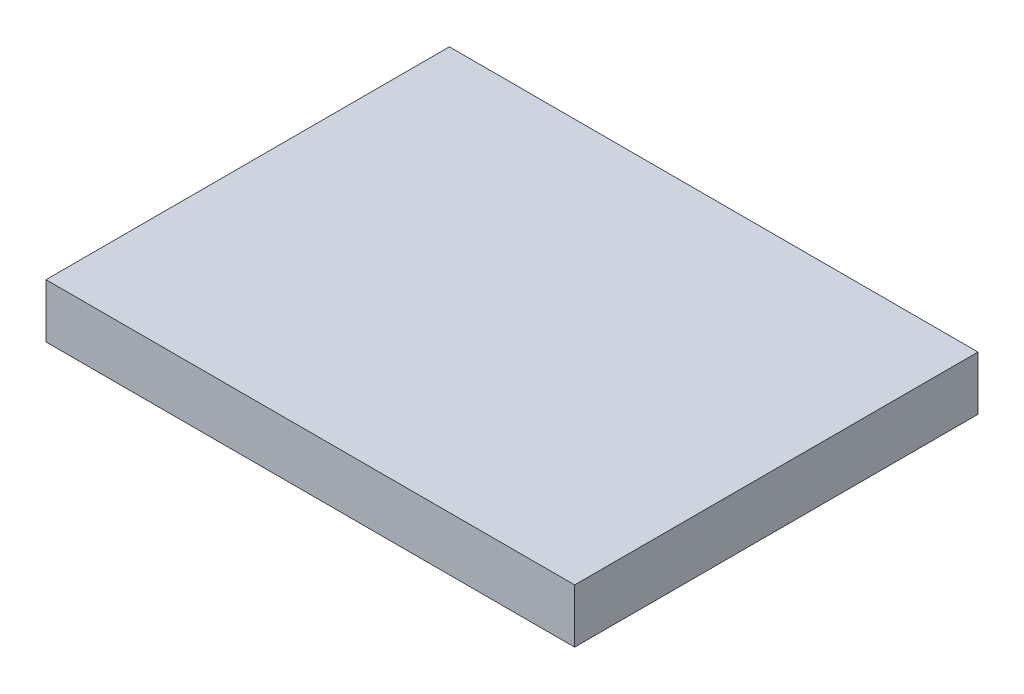
ISO-10303-21;
HEADER;
FILE_DESCRIPTION(('STEP AP214'),'2;1');
FILE_NAME('part.step','',(''),(''),'','','');
FILE_SCHEMA(('AUTOMOTIVE_DESIGN { 1 0 10303 214 1 1 1 1 }'));
ENDSEC;
DATA;
#1=APPLICATION_CONTEXT('core data for automotive mechanical design processes');
#2=APPLICATION_PROTOCOL_DEFINITION('international standard','automotive_design',2000,#1);
#3=PRODUCT_CONTEXT('',#1,'mechanical');
#4=PRODUCT('Part','Part','',(#3));
#5=PRODUCT_RELATED_PRODUCT_CATEGORY('part','',(#4));
#6=PRODUCT_DEFINITION_FORMATION('','',#4);
#7=PRODUCT_DEFINITION_CONTEXT('part definition',#1,'design');
#8=PRODUCT_DEFINITION('design','',#6,#7);
#9=PRODUCT_DEFINITION_SHAPE('','',#8);
#10=(LENGTH_UNIT() NAMED_UNIT(*) SI_UNIT(.MILLI.,.METRE.));
#11=(NAMED_UNIT(*) PLANE_ANGLE_UNIT() SI_UNIT($,.RADIAN.));
#12=(NAMED_UNIT(*) SI_UNIT($,.STERADIAN.) SOLID_ANGLE_UNIT());
#13=UNCERTAINTY_MEASURE_WITH_UNIT(LENGTH_MEASURE(1.E-05),#10,'distance_accuracy_value','');
#14=(GEOMETRIC_REPRESENTATION_CONTEXT(3) GLOBAL_UNCERTAINTY_ASSIGNED_CONTEXT((#13)) GLOBAL_UNIT_ASSIGNED_CONTEXT((#10,
#11,#12)) REPRESENTATION_CONTEXT('',''));
#15=CARTESIAN_POINT('',(0.,0.,0.));
#16=DIRECTION('',(0.,0.,1.));
#17=DIRECTION('',(1.,0.,0.));
#18=AXIS2_PLACEMENT_3D('',#15,#16,#17);
#19=CARTESIAN_POINT('',(8.5,0.,0.));
#20=DIRECTION('',(-1.,0.,0.));
#21=DIRECTION('',(0.,0.,1.));
#22=AXIS2_PLACEMENT_3D('',#19,#20,#21);
#23=PLANE('',#22);
#24=DIRECTION('',(0.,0.,1.));
#25=VECTOR('',#24,1.);
#26=CARTESIAN_POINT('',(8.5,-23.5,0.));
#27=LINE('',#26,#25);
#28=CARTESIAN_POINT('',(8.5,-23.5,-45.));
#29=VERTEX_POINT('',#28);
#30=CARTESIAN_POINT('',(8.5,-23.5,-7.61333347303129));
#31=VERTEX_POINT('',#30);
#32=EDGE_CURVE('E93',#29,#31,#27,.T.);
#33=ORIENTED_EDGE('',*,*,#32,.F.);
#34=DIRECTION('',(0.,1.,0.));
#35=VECTOR('',#34,1.);
#36=CARTESIAN_POINT('',(8.5,-23.5,-45.));
#37=LINE('',#36,#35);
#38=CARTESIAN_POINT('',(8.5,-28.5,-45.));
#39=VERTEX_POINT('',#38);
#40=EDGE_CURVE('E90',#39,#29,#37,.T.);
#41=ORIENTED_EDGE('',*,*,#40,.F.);
#42=DIRECTION('',(0.,0.,1.));
#43=VECTOR('',#42,1.);
#44=CARTESIAN_POINT('',(8.5,-28.5,0.));
#45=LINE('',#44,#43);
#46=CARTESIAN_POINT('',(8.5,-28.5,-7.61333347303129));
#47=VERTEX_POINT('',#46);
#48=EDGE_CURVE('E102',#39,#47,#45,.T.);
#49=ORIENTED_EDGE('',*,*,#48,.T.);
#50=DIRECTION('',(0.,-1.,0.));
#51=VECTOR('',#50,1.);
#52=CARTESIAN_POINT('',(8.5,0.,-7.61333347303129));
#53=LINE('',#52,#51);
#54=EDGE_CURVE('E37',#31,#47,#53,.T.);
#55=ORIENTED_EDGE('',*,*,#54,.F.);
#56=EDGE_LOOP('',(#33,#41,#49,#55));
#57=FACE_BOUND('',#56,.T.);
#58=ADVANCED_FACE('F33',(#57),#23,.T.);
#59=CARTESIAN_POINT('',(0.,0.,-7.61333347303129));
#60=DIRECTION('',(0.,0.,1.));
#61=DIRECTION('',(1.,0.,0.));
#62=AXIS2_PLACEMENT_3D('',#59,#60,#61);
#63=PLANE('',#62);
#64=ORIENTED_EDGE('',*,*,#54,.T.);
#65=DIRECTION('',(-1.,0.,0.));
#66=VECTOR('',#65,1.);
#67=CARTESIAN_POINT('',(0.,-28.5,-7.61333347303129));
#68=LINE('',#67,#66);
#69=CARTESIAN_POINT('',(57.5,-28.5,-7.61333347303129));
#70=VERTEX_POINT('',#69);
#71=EDGE_CURVE('E79',#70,#47,#68,.T.);
#72=ORIENTED_EDGE('',*,*,#71,.F.);
#73=DIRECTION('',(0.,1.,0.));
#74=VECTOR('',#73,1.);
#75=CARTESIAN_POINT('',(57.5,-18.5,-7.61333347303129));
#76=LINE('',#75,#74);
#77=CARTESIAN_POINT('',(57.5,-23.5,-7.61333347303127));
#78=VERTEX_POINT('',#77);
#79=EDGE_CURVE('E81',#70,#78,#76,.T.);
#80=ORIENTED_EDGE('',*,*,#79,.T.);
#81=DIRECTION('',(-1.,0.,0.));
#82=VECTOR('',#81,1.);
#83=CARTESIAN_POINT('',(0.,-23.5,-7.61333347303129));
#84=LINE('',#83,#82);
#85=EDGE_CURVE('E85',#78,#31,#84,.T.);
#86=ORIENTED_EDGE('',*,*,#85,.T.);
#87=EDGE_LOOP('',(#64,#72,#80,#86));
#88=FACE_BOUND('',#87,.T.);
#89=ADVANCED_FACE('F80',(#88),#63,.T.);
#90=CARTESIAN_POINT('',(57.5,-23.5,-45.));
#91=DIRECTION('',(0.,1.,0.));
#92=DIRECTION('',(0.,0.,1.));
#93=AXIS2_PLACEMENT_3D('',#90,#91,#92);
#94=PLANE('',#93);
#95=DIRECTION('',(-1.,0.,0.));
#96=VECTOR('',#95,1.);
#97=CARTESIAN_POINT('',(57.5,-23.5,-45.));
#98=LINE('',#97,#96);
#99=CARTESIAN_POINT('',(57.5,-23.5,-45.));
#100=VERTEX_POINT('',#99);
#101=EDGE_CURVE('E42',#100,#29,#98,.T.);
#102=ORIENTED_EDGE('',*,*,#101,.T.);
#103=ORIENTED_EDGE('',*,*,#32,.T.);
#104=ORIENTED_EDGE('',*,*,#85,.F.);
#105=DIRECTION('',(0.,0.,-1.));
#106=VECTOR('',#105,1.);
#107=CARTESIAN_POINT('',(57.5,-23.5,41.7013189239861));
#108=LINE('',#107,#106);
#109=EDGE_CURVE('E58',#78,#100,#108,.T.);
#110=ORIENTED_EDGE('',*,*,#109,.T.);
#111=EDGE_LOOP('',(#102,#103,#104,#110));
#112=FACE_BOUND('',#111,.T.);
#113=ADVANCED_FACE('F104',(#112),#94,.T.);
#114=CARTESIAN_POINT('',(57.5,-23.5,-45.));
#115=DIRECTION('',(0.,0.,-1.));
#116=DIRECTION('',(-1.,0.,0.));
#117=AXIS2_PLACEMENT_3D('',#114,#115,#116);
#118=PLANE('',#117);
#119=DIRECTION('',(-1.,0.,0.));
#120=VECTOR('',#119,1.);
#121=CARTESIAN_POINT('',(57.5,-28.5,-45.));
#122=LINE('',#121,#120);
#123=CARTESIAN_POINT('',(57.5,-28.5,-45.));
#124=VERTEX_POINT('',#123);
#125=EDGE_CURVE('E11',#124,#39,#122,.T.);
#126=ORIENTED_EDGE('',*,*,#125,.T.);
#127=ORIENTED_EDGE('',*,*,#40,.T.);
#128=ORIENTED_EDGE('',*,*,#101,.F.);
#129=DIRECTION('',(0.,-1.,0.));
#130=VECTOR('',#129,1.);
#131=CARTESIAN_POINT('',(57.5,-23.5,-45.));
#132=LINE('',#131,#130);
#133=EDGE_CURVE('E96',#100,#124,#132,.T.);
#134=ORIENTED_EDGE('',*,*,#133,.T.);
#135=EDGE_LOOP('',(#126,#127,#128,#134));
#136=FACE_BOUND('',#135,.T.);
#137=ADVANCED_FACE('F107',(#136),#118,.T.);
#138=CARTESIAN_POINT('',(0.,-28.5,0.));
#139=DIRECTION('',(0.,-1.,0.));
#140=DIRECTION('',(0.,0.,-1.));
#141=AXIS2_PLACEMENT_3D('',#138,#139,#140);
#142=PLANE('',#141);
#143=ORIENTED_EDGE('',*,*,#71,.T.);
#144=ORIENTED_EDGE('',*,*,#48,.F.);
#145=ORIENTED_EDGE('',*,*,#125,.F.);
#146=DIRECTION('',(0.,0.,1.));
#147=VECTOR('',#146,1.);
#148=CARTESIAN_POINT('',(57.5,-28.5,-45.));
#149=LINE('',#148,#147);
#150=EDGE_CURVE('E50',#124,#70,#149,.T.);
#151=ORIENTED_EDGE('',*,*,#150,.T.);
#152=EDGE_LOOP('',(#143,#144,#145,#151));
#153=FACE_BOUND('',#152,.T.);
#154=ADVANCED_FACE('F35',(#153),#142,.T.);
#155=CARTESIAN_POINT('',(57.5,-18.5,0.));
#156=DIRECTION('',(-1.,0.,0.));
#157=DIRECTION('',(0.,0.,1.));
#158=AXIS2_PLACEMENT_3D('',#155,#156,#157);
#159=PLANE('',#158);
#160=ORIENTED_EDGE('',*,*,#79,.F.);
#161=ORIENTED_EDGE('',*,*,#150,.F.);
#162=ORIENTED_EDGE('',*,*,#133,.F.);
#163=ORIENTED_EDGE('',*,*,#109,.F.);
#164=EDGE_LOOP('',(#160,#161,#162,#163));
#165=FACE_BOUND('',#164,.T.);
#166=ADVANCED_FACE('F89',(#165),#159,.F.);
#167=CLOSED_SHELL('',(#58,#89,#113,#137,#154,#166));
#168=MANIFOLD_SOLID_BREP('B2',#167);
#169=ADVANCED_BREP_SHAPE_REPRESENTATION('',(#18,#168),#14);
#170=SHAPE_DEFINITION_REPRESENTATION(#9,#169);
ENDSEC;
END-ISO-10303-21;
